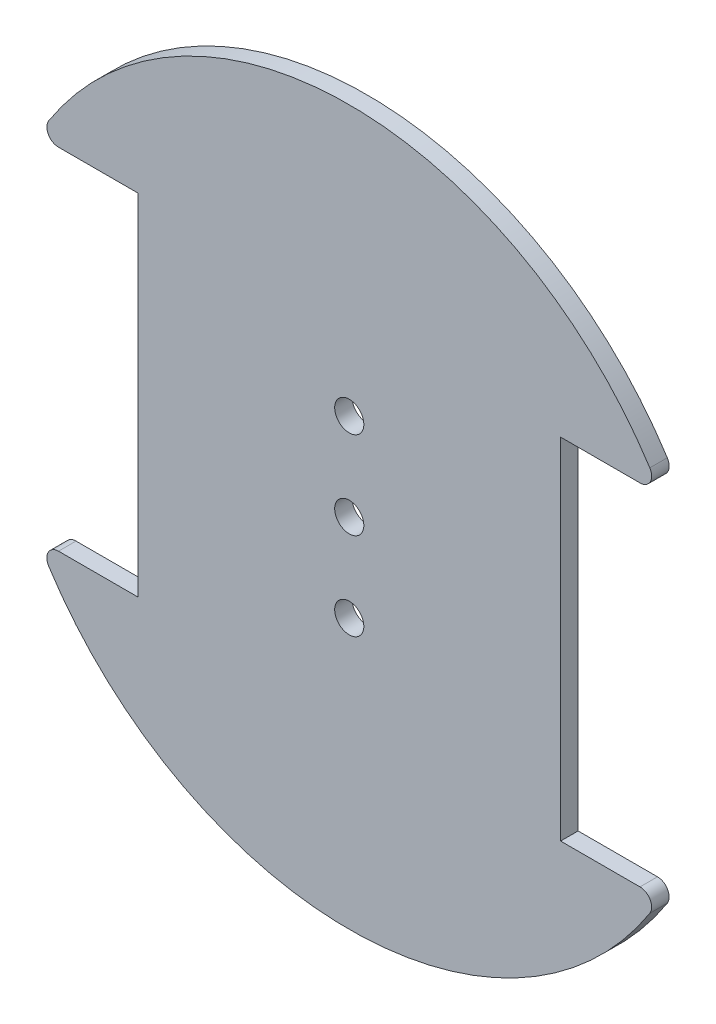
ISO-10303-21;
HEADER;
FILE_DESCRIPTION(('STEP AP214'),'2;1');
FILE_NAME('part.step','',(''),(''),'','','');
FILE_SCHEMA(('AUTOMOTIVE_DESIGN { 1 0 10303 214 1 1 1 1 }'));
ENDSEC;
DATA;
#1=APPLICATION_CONTEXT('core data for automotive mechanical design processes');
#2=APPLICATION_PROTOCOL_DEFINITION('international standard','automotive_design',2000,#1);
#3=PRODUCT_CONTEXT('',#1,'mechanical');
#4=PRODUCT('Part','Part','',(#3));
#5=PRODUCT_RELATED_PRODUCT_CATEGORY('part','',(#4));
#6=PRODUCT_DEFINITION_FORMATION('','',#4);
#7=PRODUCT_DEFINITION_CONTEXT('part definition',#1,'design');
#8=PRODUCT_DEFINITION('design','',#6,#7);
#9=PRODUCT_DEFINITION_SHAPE('','',#8);
#10=(LENGTH_UNIT() NAMED_UNIT(*) SI_UNIT(.MILLI.,.METRE.));
#11=(NAMED_UNIT(*) PLANE_ANGLE_UNIT() SI_UNIT($,.RADIAN.));
#12=(NAMED_UNIT(*) SI_UNIT($,.STERADIAN.) SOLID_ANGLE_UNIT());
#13=UNCERTAINTY_MEASURE_WITH_UNIT(LENGTH_MEASURE(1.E-05),#10,'distance_accuracy_value','');
#14=(GEOMETRIC_REPRESENTATION_CONTEXT(3) GLOBAL_UNCERTAINTY_ASSIGNED_CONTEXT((#13)) GLOBAL_UNIT_ASSIGNED_CONTEXT((#10,
#11,#12)) REPRESENTATION_CONTEXT('',''));
#15=CARTESIAN_POINT('',(0.,0.,0.));
#16=DIRECTION('',(0.,0.,1.));
#17=DIRECTION('',(1.,0.,0.));
#18=AXIS2_PLACEMENT_3D('',#15,#16,#17);
#19=CARTESIAN_POINT('',(-99.7308878933704,-64.,6.));
#20=DIRECTION('',(0.,0.,-1.));
#21=DIRECTION('',(-1.,0.,0.));
#22=AXIS2_PLACEMENT_3D('',#19,#20,#21);
#23=PLANE('',#22);
#24=CARTESIAN_POINT('',(-99.7308878933704,-64.,6.));
#25=DIRECTION('',(0.,0.,1.));
#26=DIRECTION('',(-1.,0.,0.));
#27=AXIS2_PLACEMENT_3D('',#24,#25,#26);
#28=CIRCLE('',#27,4.);
#29=CARTESIAN_POINT('',(-99.7308878933704,-60.,6.));
#30=VERTEX_POINT('',#29);
#31=CARTESIAN_POINT('',(-103.097331366564,-66.1603375527426,6.));
#32=VERTEX_POINT('',#31);
#33=EDGE_CURVE('E176',#30,#32,#28,.T.);
#34=ORIENTED_EDGE('',*,*,#33,.T.);
#35=CARTESIAN_POINT('',(-1.04083408558608E-13,0.,6.));
#36=DIRECTION('',(0.,0.,1.));
#37=DIRECTION('',(1.,0.,0.));
#38=AXIS2_PLACEMENT_3D('',#35,#36,#37);
#39=CIRCLE('',#38,122.5);
#40=CARTESIAN_POINT('',(103.097331366564,-66.1603375527425,6.));
#41=VERTEX_POINT('',#40);
#42=EDGE_CURVE('E104',#32,#41,#39,.T.);
#43=ORIENTED_EDGE('',*,*,#42,.T.);
#44=CARTESIAN_POINT('',(99.7308878933703,-63.9999999999999,6.));
#45=DIRECTION('',(0.,0.,1.));
#46=DIRECTION('',(1.,0.,0.));
#47=AXIS2_PLACEMENT_3D('',#44,#45,#46);
#48=CIRCLE('',#47,4.);
#49=CARTESIAN_POINT('',(99.7308878933703,-60.,6.));
#50=VERTEX_POINT('',#49);
#51=EDGE_CURVE('E203',#41,#50,#48,.T.);
#52=ORIENTED_EDGE('',*,*,#51,.T.);
#53=DIRECTION('',(-1.,0.,0.));
#54=VECTOR('',#53,1.);
#55=CARTESIAN_POINT('',(72.5,-60.,6.));
#56=LINE('',#55,#54);
#57=CARTESIAN_POINT('',(72.5,-60.,6.));
#58=VERTEX_POINT('',#57);
#59=EDGE_CURVE('E222',#50,#58,#56,.T.);
#60=ORIENTED_EDGE('',*,*,#59,.T.);
#61=DIRECTION('',(0.,1.,0.));
#62=VECTOR('',#61,1.);
#63=CARTESIAN_POINT('',(72.5,-60.,6.));
#64=LINE('',#63,#62);
#65=CARTESIAN_POINT('',(72.5,60.,6.));
#66=VERTEX_POINT('',#65);
#67=EDGE_CURVE('E219',#58,#66,#64,.T.);
#68=ORIENTED_EDGE('',*,*,#67,.T.);
#69=DIRECTION('',(1.,0.,0.));
#70=VECTOR('',#69,1.);
#71=CARTESIAN_POINT('',(72.5,60.,6.));
#72=LINE('',#71,#70);
#73=CARTESIAN_POINT('',(99.7308878933702,60.,6.));
#74=VERTEX_POINT('',#73);
#75=EDGE_CURVE('E221',#66,#74,#72,.T.);
#76=ORIENTED_EDGE('',*,*,#75,.T.);
#77=CARTESIAN_POINT('',(99.7308878933702,64.,6.));
#78=DIRECTION('',(0.,0.,1.));
#79=DIRECTION('',(-1.,0.,0.));
#80=AXIS2_PLACEMENT_3D('',#77,#78,#79);
#81=CIRCLE('',#80,4.00000000000001);
#82=CARTESIAN_POINT('',(103.097331366564,66.1603375527427,6.));
#83=VERTEX_POINT('',#82);
#84=EDGE_CURVE('E224',#74,#83,#81,.T.);
#85=ORIENTED_EDGE('',*,*,#84,.T.);
#86=CARTESIAN_POINT('',(-1.04083408558608E-13,0.,6.));
#87=DIRECTION('',(0.,0.,1.));
#88=DIRECTION('',(1.,0.,0.));
#89=AXIS2_PLACEMENT_3D('',#86,#87,#88);
#90=CIRCLE('',#89,122.5);
#91=CARTESIAN_POINT('',(-103.097331366564,66.1603375527426,6.));
#92=VERTEX_POINT('',#91);
#93=EDGE_CURVE('E230',#83,#92,#90,.T.);
#94=ORIENTED_EDGE('',*,*,#93,.T.);
#95=CARTESIAN_POINT('',(-99.7308878933705,64.,6.));
#96=DIRECTION('',(0.,0.,1.));
#97=DIRECTION('',(1.,0.,0.));
#98=AXIS2_PLACEMENT_3D('',#95,#96,#97);
#99=CIRCLE('',#98,4.00000000000001);
#100=CARTESIAN_POINT('',(-99.7308878933705,60.,6.));
#101=VERTEX_POINT('',#100);
#102=EDGE_CURVE('E135',#92,#101,#99,.T.);
#103=ORIENTED_EDGE('',*,*,#102,.T.);
#104=DIRECTION('',(1.,0.,0.));
#105=VECTOR('',#104,1.);
#106=CARTESIAN_POINT('',(-72.5,60.,6.));
#107=LINE('',#106,#105);
#108=CARTESIAN_POINT('',(-72.5,60.,6.));
#109=VERTEX_POINT('',#108);
#110=EDGE_CURVE('E129',#101,#109,#107,.T.);
#111=ORIENTED_EDGE('',*,*,#110,.T.);
#112=DIRECTION('',(0.,-1.,0.));
#113=VECTOR('',#112,1.);
#114=CARTESIAN_POINT('',(-72.5,-60.,6.));
#115=LINE('',#114,#113);
#116=CARTESIAN_POINT('',(-72.5,-60.,6.));
#117=VERTEX_POINT('',#116);
#118=EDGE_CURVE('E133',#109,#117,#115,.T.);
#119=ORIENTED_EDGE('',*,*,#118,.T.);
#120=DIRECTION('',(-1.,0.,0.));
#121=VECTOR('',#120,1.);
#122=CARTESIAN_POINT('',(-72.5,-60.,6.));
#123=LINE('',#122,#121);
#124=EDGE_CURVE('E49',#117,#30,#123,.T.);
#125=ORIENTED_EDGE('',*,*,#124,.T.);
#126=EDGE_LOOP('',(#34,#43,#52,#60,#68,#76,#85,#94,#103,#111,#119,#125));
#127=FACE_BOUND('',#126,.T.);
#128=CARTESIAN_POINT('',(0.,-30.,6.));
#129=DIRECTION('',(0.,0.,1.));
#130=DIRECTION('',(1.,0.,0.));
#131=AXIS2_PLACEMENT_3D('',#128,#129,#130);
#132=CIRCLE('',#131,5.);
#133=CARTESIAN_POINT('',(5.,-30.,6.));
#134=VERTEX_POINT('',#133);
#135=EDGE_CURVE('E157',#134,#134,#132,.T.);
#136=ORIENTED_EDGE('',*,*,#135,.F.);
#137=EDGE_LOOP('',(#136));
#138=FACE_BOUND('',#137,.T.);
#139=CARTESIAN_POINT('',(-1.04083408558608E-13,0.,6.));
#140=DIRECTION('',(0.,0.,1.));
#141=DIRECTION('',(1.,0.,0.));
#142=AXIS2_PLACEMENT_3D('',#139,#140,#141);
#143=CIRCLE('',#142,5.);
#144=CARTESIAN_POINT('',(4.9999999999999,0.,6.));
#145=VERTEX_POINT('',#144);
#146=EDGE_CURVE('E284',#145,#145,#143,.T.);
#147=ORIENTED_EDGE('',*,*,#146,.F.);
#148=EDGE_LOOP('',(#147));
#149=FACE_BOUND('',#148,.T.);
#150=CARTESIAN_POINT('',(-2.08166817117217E-13,30.,6.));
#151=DIRECTION('',(0.,0.,1.));
#152=DIRECTION('',(1.,0.,0.));
#153=AXIS2_PLACEMENT_3D('',#150,#151,#152);
#154=CIRCLE('',#153,5.);
#155=CARTESIAN_POINT('',(4.99999999999979,30.,6.));
#156=VERTEX_POINT('',#155);
#157=EDGE_CURVE('E275',#156,#156,#154,.T.);
#158=ORIENTED_EDGE('',*,*,#157,.F.);
#159=EDGE_LOOP('',(#158));
#160=FACE_BOUND('',#159,.T.);
#161=ADVANCED_FACE('F32',(#127,#138,#149,#160),#23,.F.);
#162=CARTESIAN_POINT('',(-99.7308878933704,-64.,0.));
#163=DIRECTION('',(0.,0.,-1.));
#164=DIRECTION('',(-1.,0.,0.));
#165=AXIS2_PLACEMENT_3D('',#162,#163,#164);
#166=PLANE('',#165);
#167=CARTESIAN_POINT('',(-1.04083408558608E-13,0.,0.));
#168=DIRECTION('',(0.,0.,1.));
#169=DIRECTION('',(1.,0.,0.));
#170=AXIS2_PLACEMENT_3D('',#167,#168,#169);
#171=CIRCLE('',#170,5.);
#172=CARTESIAN_POINT('',(4.9999999999999,0.,0.));
#173=VERTEX_POINT('',#172);
#174=EDGE_CURVE('E281',#173,#173,#171,.T.);
#175=ORIENTED_EDGE('',*,*,#174,.T.);
#176=EDGE_LOOP('',(#175));
#177=FACE_BOUND('',#176,.T.);
#178=CARTESIAN_POINT('',(-99.7308878933704,-64.,0.));
#179=DIRECTION('',(0.,0.,1.));
#180=DIRECTION('',(-1.,0.,0.));
#181=AXIS2_PLACEMENT_3D('',#178,#179,#180);
#182=CIRCLE('',#181,4.);
#183=CARTESIAN_POINT('',(-99.7308878933704,-60.,0.));
#184=VERTEX_POINT('',#183);
#185=CARTESIAN_POINT('',(-103.097331366564,-66.1603375527426,0.));
#186=VERTEX_POINT('',#185);
#187=EDGE_CURVE('E153',#184,#186,#182,.T.);
#188=ORIENTED_EDGE('',*,*,#187,.F.);
#189=DIRECTION('',(-1.,0.,0.));
#190=VECTOR('',#189,1.);
#191=CARTESIAN_POINT('',(-72.5,-60.,0.));
#192=LINE('',#191,#190);
#193=CARTESIAN_POINT('',(-72.5,-60.,0.));
#194=VERTEX_POINT('',#193);
#195=EDGE_CURVE('E96',#194,#184,#192,.T.);
#196=ORIENTED_EDGE('',*,*,#195,.F.);
#197=DIRECTION('',(0.,-1.,0.));
#198=VECTOR('',#197,1.);
#199=CARTESIAN_POINT('',(-72.5,-60.,0.));
#200=LINE('',#199,#198);
#201=CARTESIAN_POINT('',(-72.5,60.,0.));
#202=VERTEX_POINT('',#201);
#203=EDGE_CURVE('E90',#202,#194,#200,.T.);
#204=ORIENTED_EDGE('',*,*,#203,.F.);
#205=DIRECTION('',(1.,0.,0.));
#206=VECTOR('',#205,1.);
#207=CARTESIAN_POINT('',(-72.5,60.,0.));
#208=LINE('',#207,#206);
#209=CARTESIAN_POINT('',(-99.7308878933705,60.,0.));
#210=VERTEX_POINT('',#209);
#211=EDGE_CURVE('E143',#210,#202,#208,.T.);
#212=ORIENTED_EDGE('',*,*,#211,.F.);
#213=CARTESIAN_POINT('',(-99.7308878933705,64.,0.));
#214=DIRECTION('',(0.,0.,1.));
#215=DIRECTION('',(1.,0.,0.));
#216=AXIS2_PLACEMENT_3D('',#213,#214,#215);
#217=CIRCLE('',#216,4.00000000000001);
#218=CARTESIAN_POINT('',(-103.097331366564,66.1603375527426,0.));
#219=VERTEX_POINT('',#218);
#220=EDGE_CURVE('E171',#219,#210,#217,.T.);
#221=ORIENTED_EDGE('',*,*,#220,.F.);
#222=CARTESIAN_POINT('',(-1.04083408558608E-13,0.,0.));
#223=DIRECTION('',(0.,0.,1.));
#224=DIRECTION('',(1.,0.,0.));
#225=AXIS2_PLACEMENT_3D('',#222,#223,#224);
#226=CIRCLE('',#225,122.5);
#227=CARTESIAN_POINT('',(103.097331366564,66.1603375527427,0.));
#228=VERTEX_POINT('',#227);
#229=EDGE_CURVE('E169',#228,#219,#226,.T.);
#230=ORIENTED_EDGE('',*,*,#229,.F.);
#231=CARTESIAN_POINT('',(99.7308878933702,64.,0.));
#232=DIRECTION('',(0.,0.,1.));
#233=DIRECTION('',(-1.,0.,0.));
#234=AXIS2_PLACEMENT_3D('',#231,#232,#233);
#235=CIRCLE('',#234,4.00000000000001);
#236=CARTESIAN_POINT('',(99.7308878933702,60.,0.));
#237=VERTEX_POINT('',#236);
#238=EDGE_CURVE('E167',#237,#228,#235,.T.);
#239=ORIENTED_EDGE('',*,*,#238,.F.);
#240=DIRECTION('',(1.,0.,0.));
#241=VECTOR('',#240,1.);
#242=CARTESIAN_POINT('',(72.5,60.,0.));
#243=LINE('',#242,#241);
#244=CARTESIAN_POINT('',(72.5,60.,0.));
#245=VERTEX_POINT('',#244);
#246=EDGE_CURVE('E165',#245,#237,#243,.T.);
#247=ORIENTED_EDGE('',*,*,#246,.F.);
#248=DIRECTION('',(0.,1.,0.));
#249=VECTOR('',#248,1.);
#250=CARTESIAN_POINT('',(72.5,-60.,0.));
#251=LINE('',#250,#249);
#252=CARTESIAN_POINT('',(72.5,-60.,0.));
#253=VERTEX_POINT('',#252);
#254=EDGE_CURVE('E163',#253,#245,#251,.T.);
#255=ORIENTED_EDGE('',*,*,#254,.F.);
#256=DIRECTION('',(-1.,0.,0.));
#257=VECTOR('',#256,1.);
#258=CARTESIAN_POINT('',(72.5,-60.,0.));
#259=LINE('',#258,#257);
#260=CARTESIAN_POINT('',(99.7308878933703,-60.,0.));
#261=VERTEX_POINT('',#260);
#262=EDGE_CURVE('E161',#261,#253,#259,.T.);
#263=ORIENTED_EDGE('',*,*,#262,.F.);
#264=CARTESIAN_POINT('',(99.7308878933703,-63.9999999999999,0.));
#265=DIRECTION('',(0.,0.,1.));
#266=DIRECTION('',(1.,0.,0.));
#267=AXIS2_PLACEMENT_3D('',#264,#265,#266);
#268=CIRCLE('',#267,4.);
#269=CARTESIAN_POINT('',(103.097331366564,-66.1603375527425,0.));
#270=VERTEX_POINT('',#269);
#271=EDGE_CURVE('E159',#270,#261,#268,.T.);
#272=ORIENTED_EDGE('',*,*,#271,.F.);
#273=CARTESIAN_POINT('',(-1.04083408558608E-13,0.,0.));
#274=DIRECTION('',(0.,0.,1.));
#275=DIRECTION('',(1.,0.,0.));
#276=AXIS2_PLACEMENT_3D('',#273,#274,#275);
#277=CIRCLE('',#276,122.5);
#278=EDGE_CURVE('E156',#186,#270,#277,.T.);
#279=ORIENTED_EDGE('',*,*,#278,.F.);
#280=EDGE_LOOP('',(#188,#196,#204,#212,#221,#230,#239,#247,#255,#263,#272,#279));
#281=FACE_BOUND('',#280,.T.);
#282=CARTESIAN_POINT('',(0.,-30.,0.));
#283=DIRECTION('',(0.,0.,1.));
#284=DIRECTION('',(1.,0.,0.));
#285=AXIS2_PLACEMENT_3D('',#282,#283,#284);
#286=CIRCLE('',#285,5.);
#287=CARTESIAN_POINT('',(5.,-30.,0.));
#288=VERTEX_POINT('',#287);
#289=EDGE_CURVE('E287',#288,#288,#286,.T.);
#290=ORIENTED_EDGE('',*,*,#289,.T.);
#291=EDGE_LOOP('',(#290));
#292=FACE_BOUND('',#291,.T.);
#293=CARTESIAN_POINT('',(-2.08166817117217E-13,30.,0.));
#294=DIRECTION('',(0.,0.,1.));
#295=DIRECTION('',(1.,0.,0.));
#296=AXIS2_PLACEMENT_3D('',#293,#294,#295);
#297=CIRCLE('',#296,5.);
#298=CARTESIAN_POINT('',(4.99999999999979,30.,0.));
#299=VERTEX_POINT('',#298);
#300=EDGE_CURVE('E278',#299,#299,#297,.T.);
#301=ORIENTED_EDGE('',*,*,#300,.T.);
#302=EDGE_LOOP('',(#301));
#303=FACE_BOUND('',#302,.T.);
#304=ADVANCED_FACE('F207',(#177,#281,#292,#303),#166,.T.);
#305=CARTESIAN_POINT('',(-99.7308878933704,-64.,6.));
#306=DIRECTION('',(0.,0.,-1.));
#307=DIRECTION('',(-1.,0.,0.));
#308=AXIS2_PLACEMENT_3D('',#305,#306,#307);
#309=CYLINDRICAL_SURFACE('',#308,4.);
#310=ORIENTED_EDGE('',*,*,#187,.T.);
#311=DIRECTION('',(0.,0.,-1.));
#312=VECTOR('',#311,1.);
#313=CARTESIAN_POINT('',(-103.097331366564,-66.1603375527426,6.));
#314=LINE('',#313,#312);
#315=EDGE_CURVE('E11',#32,#186,#314,.T.);
#316=ORIENTED_EDGE('',*,*,#315,.F.);
#317=ORIENTED_EDGE('',*,*,#33,.F.);
#318=DIRECTION('',(0.,0.,-1.));
#319=VECTOR('',#318,1.);
#320=CARTESIAN_POINT('',(-99.7308878933704,-60.,6.));
#321=LINE('',#320,#319);
#322=EDGE_CURVE('E149',#30,#184,#321,.T.);
#323=ORIENTED_EDGE('',*,*,#322,.T.);
#324=EDGE_LOOP('',(#310,#316,#317,#323));
#325=FACE_BOUND('',#324,.T.);
#326=ADVANCED_FACE('F34',(#325),#309,.T.);
#327=CARTESIAN_POINT('',(-1.04083408558608E-13,0.,6.));
#328=DIRECTION('',(0.,0.,-1.));
#329=DIRECTION('',(-1.,0.,0.));
#330=AXIS2_PLACEMENT_3D('',#327,#328,#329);
#331=CYLINDRICAL_SURFACE('',#330,122.5);
#332=ORIENTED_EDGE('',*,*,#278,.T.);
#333=DIRECTION('',(0.,0.,-1.));
#334=VECTOR('',#333,1.);
#335=CARTESIAN_POINT('',(103.097331366564,-66.1603375527425,6.));
#336=LINE('',#335,#334);
#337=EDGE_CURVE('E41',#41,#270,#336,.T.);
#338=ORIENTED_EDGE('',*,*,#337,.F.);
#339=ORIENTED_EDGE('',*,*,#42,.F.);
#340=ORIENTED_EDGE('',*,*,#315,.T.);
#341=EDGE_LOOP('',(#332,#338,#339,#340));
#342=FACE_BOUND('',#341,.T.);
#343=ADVANCED_FACE('F390',(#342),#331,.T.);
#344=CARTESIAN_POINT('',(99.7308878933703,-63.9999999999999,6.));
#345=DIRECTION('',(0.,0.,-1.));
#346=DIRECTION('',(-1.,0.,0.));
#347=AXIS2_PLACEMENT_3D('',#344,#345,#346);
#348=CYLINDRICAL_SURFACE('',#347,4.);
#349=ORIENTED_EDGE('',*,*,#271,.T.);
#350=DIRECTION('',(0.,0.,-1.));
#351=VECTOR('',#350,1.);
#352=CARTESIAN_POINT('',(99.7308878933703,-60.,6.));
#353=LINE('',#352,#351);
#354=EDGE_CURVE('E195',#50,#261,#353,.T.);
#355=ORIENTED_EDGE('',*,*,#354,.F.);
#356=ORIENTED_EDGE('',*,*,#51,.F.);
#357=ORIENTED_EDGE('',*,*,#337,.T.);
#358=EDGE_LOOP('',(#349,#355,#356,#357));
#359=FACE_BOUND('',#358,.T.);
#360=ADVANCED_FACE('F201',(#359),#348,.T.);
#361=CARTESIAN_POINT('',(72.5,-60.,6.));
#362=DIRECTION('',(0.,-1.,0.));
#363=DIRECTION('',(0.,0.,-1.));
#364=AXIS2_PLACEMENT_3D('',#361,#362,#363);
#365=PLANE('',#364);
#366=ORIENTED_EDGE('',*,*,#262,.T.);
#367=DIRECTION('',(0.,0.,-1.));
#368=VECTOR('',#367,1.);
#369=CARTESIAN_POINT('',(72.5,-60.,6.));
#370=LINE('',#369,#368);
#371=EDGE_CURVE('E192',#58,#253,#370,.T.);
#372=ORIENTED_EDGE('',*,*,#371,.F.);
#373=ORIENTED_EDGE('',*,*,#59,.F.);
#374=ORIENTED_EDGE('',*,*,#354,.T.);
#375=EDGE_LOOP('',(#366,#372,#373,#374));
#376=FACE_BOUND('',#375,.T.);
#377=ADVANCED_FACE('F213',(#376),#365,.F.);
#378=CARTESIAN_POINT('',(72.5,-60.,6.));
#379=DIRECTION('',(-1.,0.,0.));
#380=DIRECTION('',(0.,0.,1.));
#381=AXIS2_PLACEMENT_3D('',#378,#379,#380);
#382=PLANE('',#381);
#383=ORIENTED_EDGE('',*,*,#254,.T.);
#384=DIRECTION('',(0.,0.,-1.));
#385=VECTOR('',#384,1.);
#386=CARTESIAN_POINT('',(72.5,60.,6.));
#387=LINE('',#386,#385);
#388=EDGE_CURVE('E189',#66,#245,#387,.T.);
#389=ORIENTED_EDGE('',*,*,#388,.F.);
#390=ORIENTED_EDGE('',*,*,#67,.F.);
#391=ORIENTED_EDGE('',*,*,#371,.T.);
#392=EDGE_LOOP('',(#383,#389,#390,#391));
#393=FACE_BOUND('',#392,.T.);
#394=ADVANCED_FACE('F217',(#393),#382,.F.);
#395=CARTESIAN_POINT('',(72.5,60.,6.));
#396=DIRECTION('',(0.,1.,0.));
#397=DIRECTION('',(0.,0.,1.));
#398=AXIS2_PLACEMENT_3D('',#395,#396,#397);
#399=PLANE('',#398);
#400=ORIENTED_EDGE('',*,*,#246,.T.);
#401=DIRECTION('',(0.,0.,-1.));
#402=VECTOR('',#401,1.);
#403=CARTESIAN_POINT('',(99.7308878933702,60.,6.));
#404=LINE('',#403,#402);
#405=EDGE_CURVE('E186',#74,#237,#404,.T.);
#406=ORIENTED_EDGE('',*,*,#405,.F.);
#407=ORIENTED_EDGE('',*,*,#75,.F.);
#408=ORIENTED_EDGE('',*,*,#388,.T.);
#409=EDGE_LOOP('',(#400,#406,#407,#408));
#410=FACE_BOUND('',#409,.T.);
#411=ADVANCED_FACE('F355',(#410),#399,.F.);
#412=CARTESIAN_POINT('',(99.7308878933702,64.,6.));
#413=DIRECTION('',(0.,0.,-1.));
#414=DIRECTION('',(-1.,0.,0.));
#415=AXIS2_PLACEMENT_3D('',#412,#413,#414);
#416=CYLINDRICAL_SURFACE('',#415,4.00000000000001);
#417=ORIENTED_EDGE('',*,*,#238,.T.);
#418=DIRECTION('',(0.,0.,-1.));
#419=VECTOR('',#418,1.);
#420=CARTESIAN_POINT('',(103.097331366564,66.1603375527427,6.));
#421=LINE('',#420,#419);
#422=EDGE_CURVE('E183',#83,#228,#421,.T.);
#423=ORIENTED_EDGE('',*,*,#422,.F.);
#424=ORIENTED_EDGE('',*,*,#84,.F.);
#425=ORIENTED_EDGE('',*,*,#405,.T.);
#426=EDGE_LOOP('',(#417,#423,#424,#425));
#427=FACE_BOUND('',#426,.T.);
#428=ADVANCED_FACE('F346',(#427),#416,.T.);
#429=CARTESIAN_POINT('',(-1.04083408558608E-13,0.,6.));
#430=DIRECTION('',(0.,0.,-1.));
#431=DIRECTION('',(-1.,0.,0.));
#432=AXIS2_PLACEMENT_3D('',#429,#430,#431);
#433=CYLINDRICAL_SURFACE('',#432,122.5);
#434=ORIENTED_EDGE('',*,*,#229,.T.);
#435=DIRECTION('',(0.,0.,-1.));
#436=VECTOR('',#435,1.);
#437=CARTESIAN_POINT('',(-103.097331366564,66.1603375527426,6.));
#438=LINE('',#437,#436);
#439=EDGE_CURVE('E180',#92,#219,#438,.T.);
#440=ORIENTED_EDGE('',*,*,#439,.F.);
#441=ORIENTED_EDGE('',*,*,#93,.F.);
#442=ORIENTED_EDGE('',*,*,#422,.T.);
#443=EDGE_LOOP('',(#434,#440,#441,#442));
#444=FACE_BOUND('',#443,.T.);
#445=ADVANCED_FACE('F236',(#444),#433,.T.);
#446=CARTESIAN_POINT('',(-99.7308878933705,64.,6.));
#447=DIRECTION('',(0.,0.,-1.));
#448=DIRECTION('',(-1.,0.,0.));
#449=AXIS2_PLACEMENT_3D('',#446,#447,#448);
#450=CYLINDRICAL_SURFACE('',#449,4.00000000000001);
#451=ORIENTED_EDGE('',*,*,#220,.T.);
#452=DIRECTION('',(0.,0.,-1.));
#453=VECTOR('',#452,1.);
#454=CARTESIAN_POINT('',(-99.7308878933705,60.,6.));
#455=LINE('',#454,#453);
#456=EDGE_CURVE('E144',#101,#210,#455,.T.);
#457=ORIENTED_EDGE('',*,*,#456,.F.);
#458=ORIENTED_EDGE('',*,*,#102,.F.);
#459=ORIENTED_EDGE('',*,*,#439,.T.);
#460=EDGE_LOOP('',(#451,#457,#458,#459));
#461=FACE_BOUND('',#460,.T.);
#462=ADVANCED_FACE('F240',(#461),#450,.T.);
#463=CARTESIAN_POINT('',(-72.5,60.,6.));
#464=DIRECTION('',(0.,1.,0.));
#465=DIRECTION('',(0.,0.,1.));
#466=AXIS2_PLACEMENT_3D('',#463,#464,#465);
#467=PLANE('',#466);
#468=ORIENTED_EDGE('',*,*,#211,.T.);
#469=DIRECTION('',(0.,0.,-1.));
#470=VECTOR('',#469,1.);
#471=CARTESIAN_POINT('',(-72.5,60.,6.));
#472=LINE('',#471,#470);
#473=EDGE_CURVE('E140',#109,#202,#472,.T.);
#474=ORIENTED_EDGE('',*,*,#473,.F.);
#475=ORIENTED_EDGE('',*,*,#110,.F.);
#476=ORIENTED_EDGE('',*,*,#456,.T.);
#477=EDGE_LOOP('',(#468,#474,#475,#476));
#478=FACE_BOUND('',#477,.T.);
#479=ADVANCED_FACE('F141',(#478),#467,.F.);
#480=CARTESIAN_POINT('',(-72.5,-60.,6.));
#481=DIRECTION('',(1.,0.,0.));
#482=DIRECTION('',(0.,0.,-1.));
#483=AXIS2_PLACEMENT_3D('',#480,#481,#482);
#484=PLANE('',#483);
#485=ORIENTED_EDGE('',*,*,#203,.T.);
#486=DIRECTION('',(0.,0.,-1.));
#487=VECTOR('',#486,1.);
#488=CARTESIAN_POINT('',(-72.5,-60.,6.));
#489=LINE('',#488,#487);
#490=EDGE_CURVE('E145',#117,#194,#489,.T.);
#491=ORIENTED_EDGE('',*,*,#490,.F.);
#492=ORIENTED_EDGE('',*,*,#118,.F.);
#493=ORIENTED_EDGE('',*,*,#473,.T.);
#494=EDGE_LOOP('',(#485,#491,#492,#493));
#495=FACE_BOUND('',#494,.T.);
#496=ADVANCED_FACE('F147',(#495),#484,.F.);
#497=CARTESIAN_POINT('',(-72.5,-60.,6.));
#498=DIRECTION('',(0.,-1.,0.));
#499=DIRECTION('',(0.,0.,-1.));
#500=AXIS2_PLACEMENT_3D('',#497,#498,#499);
#501=PLANE('',#500);
#502=ORIENTED_EDGE('',*,*,#195,.T.);
#503=ORIENTED_EDGE('',*,*,#322,.F.);
#504=ORIENTED_EDGE('',*,*,#124,.F.);
#505=ORIENTED_EDGE('',*,*,#490,.T.);
#506=EDGE_LOOP('',(#502,#503,#504,#505));
#507=FACE_BOUND('',#506,.T.);
#508=ADVANCED_FACE('F244',(#507),#501,.F.);
#509=CARTESIAN_POINT('',(0.,-30.,6.));
#510=DIRECTION('',(0.,0.,-1.));
#511=DIRECTION('',(-1.,0.,0.));
#512=AXIS2_PLACEMENT_3D('',#509,#510,#511);
#513=CYLINDRICAL_SURFACE('',#512,5.);
#514=ORIENTED_EDGE('',*,*,#135,.T.);
#515=EDGE_LOOP('',(#514));
#516=FACE_BOUND('',#515,.T.);
#517=ORIENTED_EDGE('',*,*,#289,.F.);
#518=EDGE_LOOP('',(#517));
#519=FACE_BOUND('',#518,.T.);
#520=ADVANCED_FACE('F246',(#516,#519),#513,.F.);
#521=CARTESIAN_POINT('',(-1.04083408558608E-13,0.,6.));
#522=DIRECTION('',(0.,0.,-1.));
#523=DIRECTION('',(-1.,0.,0.));
#524=AXIS2_PLACEMENT_3D('',#521,#522,#523);
#525=CYLINDRICAL_SURFACE('',#524,5.);
#526=ORIENTED_EDGE('',*,*,#146,.T.);
#527=EDGE_LOOP('',(#526));
#528=FACE_BOUND('',#527,.T.);
#529=ORIENTED_EDGE('',*,*,#174,.F.);
#530=EDGE_LOOP('',(#529));
#531=FACE_BOUND('',#530,.T.);
#532=ADVANCED_FACE('F252',(#528,#531),#525,.F.);
#533=CARTESIAN_POINT('',(-2.08166817117217E-13,30.,6.));
#534=DIRECTION('',(0.,0.,-1.));
#535=DIRECTION('',(-1.,0.,0.));
#536=AXIS2_PLACEMENT_3D('',#533,#534,#535);
#537=CYLINDRICAL_SURFACE('',#536,5.);
#538=ORIENTED_EDGE('',*,*,#157,.T.);
#539=EDGE_LOOP('',(#538));
#540=FACE_BOUND('',#539,.T.);
#541=ORIENTED_EDGE('',*,*,#300,.F.);
#542=EDGE_LOOP('',(#541));
#543=FACE_BOUND('',#542,.T.);
#544=ADVANCED_FACE('F266',(#540,#543),#537,.F.);
#545=CLOSED_SHELL('',(#161,#304,#326,#343,#360,#377,#394,#411,#428,#445,#462,#479,#496,#508,
#520,#532,#544));
#546=MANIFOLD_SOLID_BREP('B2',#545);
#547=ADVANCED_BREP_SHAPE_REPRESENTATION('',(#18,#546),#14);
#548=SHAPE_DEFINITION_REPRESENTATION(#9,#547);
ENDSEC;
END-ISO-10303-21;
